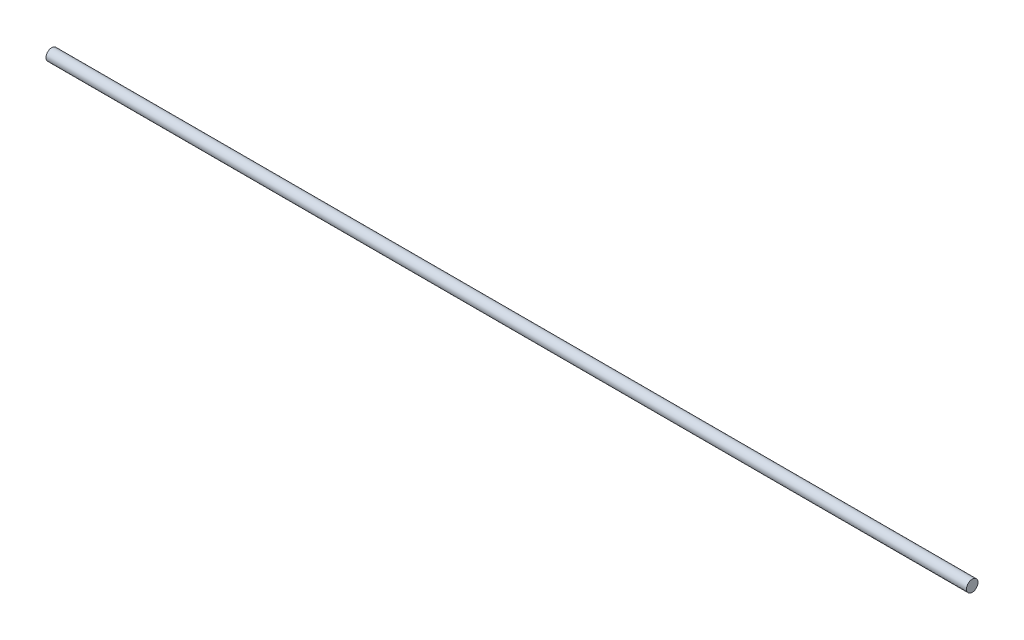
ISO-10303-21;
HEADER;
FILE_DESCRIPTION(('STEP AP214'),'2;1');
FILE_NAME('part.step','',(''),(''),'','','');
FILE_SCHEMA(('AUTOMOTIVE_DESIGN { 1 0 10303 214 1 1 1 1 }'));
ENDSEC;
DATA;
#1=APPLICATION_CONTEXT('core data for automotive mechanical design processes');
#2=APPLICATION_PROTOCOL_DEFINITION('international standard','automotive_design',2000,#1);
#3=PRODUCT_CONTEXT('',#1,'mechanical');
#4=PRODUCT('Part','Part','',(#3));
#5=PRODUCT_RELATED_PRODUCT_CATEGORY('part','',(#4));
#6=PRODUCT_DEFINITION_FORMATION('','',#4);
#7=PRODUCT_DEFINITION_CONTEXT('part definition',#1,'design');
#8=PRODUCT_DEFINITION('design','',#6,#7);
#9=PRODUCT_DEFINITION_SHAPE('','',#8);
#10=(LENGTH_UNIT() NAMED_UNIT(*) SI_UNIT(.MILLI.,.METRE.));
#11=(NAMED_UNIT(*) PLANE_ANGLE_UNIT() SI_UNIT($,.RADIAN.));
#12=(NAMED_UNIT(*) SI_UNIT($,.STERADIAN.) SOLID_ANGLE_UNIT());
#13=UNCERTAINTY_MEASURE_WITH_UNIT(LENGTH_MEASURE(1.E-05),#10,'distance_accuracy_value','');
#14=(GEOMETRIC_REPRESENTATION_CONTEXT(3) GLOBAL_UNCERTAINTY_ASSIGNED_CONTEXT((#13)) GLOBAL_UNIT_ASSIGNED_CONTEXT((#10,
#11,#12)) REPRESENTATION_CONTEXT('',''));
#15=CARTESIAN_POINT('',(0.,0.,0.));
#16=DIRECTION('',(0.,0.,1.));
#17=DIRECTION('',(1.,0.,0.));
#18=AXIS2_PLACEMENT_3D('',#15,#16,#17);
#19=CARTESIAN_POINT('',(800.,0.,0.));
#20=DIRECTION('',(-1.,0.,0.));
#21=DIRECTION('',(0.,0.,1.));
#22=AXIS2_PLACEMENT_3D('',#19,#20,#21);
#23=CYLINDRICAL_SURFACE('',#22,10.);
#24=CARTESIAN_POINT('',(800.,0.,0.));
#25=DIRECTION('',(1.,0.,0.));
#26=DIRECTION('',(0.,0.,-1.));
#27=AXIS2_PLACEMENT_3D('',#24,#25,#26);
#28=CIRCLE('',#27,10.);
#29=CARTESIAN_POINT('',(800.,0.,-10.));
#30=VERTEX_POINT('',#29);
#31=EDGE_CURVE('E10',#30,#30,#28,.T.);
#32=ORIENTED_EDGE('',*,*,#31,.F.);
#33=EDGE_LOOP('',(#32));
#34=FACE_BOUND('',#33,.T.);
#35=CARTESIAN_POINT('',(-800.,0.,0.));
#36=DIRECTION('',(1.,0.,0.));
#37=DIRECTION('',(0.,0.,-1.));
#38=AXIS2_PLACEMENT_3D('',#35,#36,#37);
#39=CIRCLE('',#38,10.);
#40=CARTESIAN_POINT('',(-800.,0.,-10.));
#41=VERTEX_POINT('',#40);
#42=EDGE_CURVE('E35',#41,#41,#39,.T.);
#43=ORIENTED_EDGE('',*,*,#42,.T.);
#44=EDGE_LOOP('',(#43));
#45=FACE_BOUND('',#44,.T.);
#46=ADVANCED_FACE('F32',(#34,#45),#23,.T.);
#47=CARTESIAN_POINT('',(800.,0.,0.));
#48=DIRECTION('',(1.,0.,0.));
#49=DIRECTION('',(0.,0.,-1.));
#50=AXIS2_PLACEMENT_3D('',#47,#48,#49);
#51=PLANE('',#50);
#52=ORIENTED_EDGE('',*,*,#31,.T.);
#53=EDGE_LOOP('',(#52));
#54=FACE_BOUND('',#53,.T.);
#55=ADVANCED_FACE('F47',(#54),#51,.T.);
#56=CARTESIAN_POINT('',(-800.,0.,0.));
#57=DIRECTION('',(1.,0.,0.));
#58=DIRECTION('',(0.,0.,-1.));
#59=AXIS2_PLACEMENT_3D('',#56,#57,#58);
#60=PLANE('',#59);
#61=ORIENTED_EDGE('',*,*,#42,.F.);
#62=EDGE_LOOP('',(#61));
#63=FACE_BOUND('',#62,.T.);
#64=ADVANCED_FACE('F45',(#63),#60,.F.);
#65=CLOSED_SHELL('',(#46,#55,#64));
#66=MANIFOLD_SOLID_BREP('B2',#65);
#67=ADVANCED_BREP_SHAPE_REPRESENTATION('',(#18,#66),#14);
#68=SHAPE_DEFINITION_REPRESENTATION(#9,#67);
ENDSEC;
END-ISO-10303-21;
